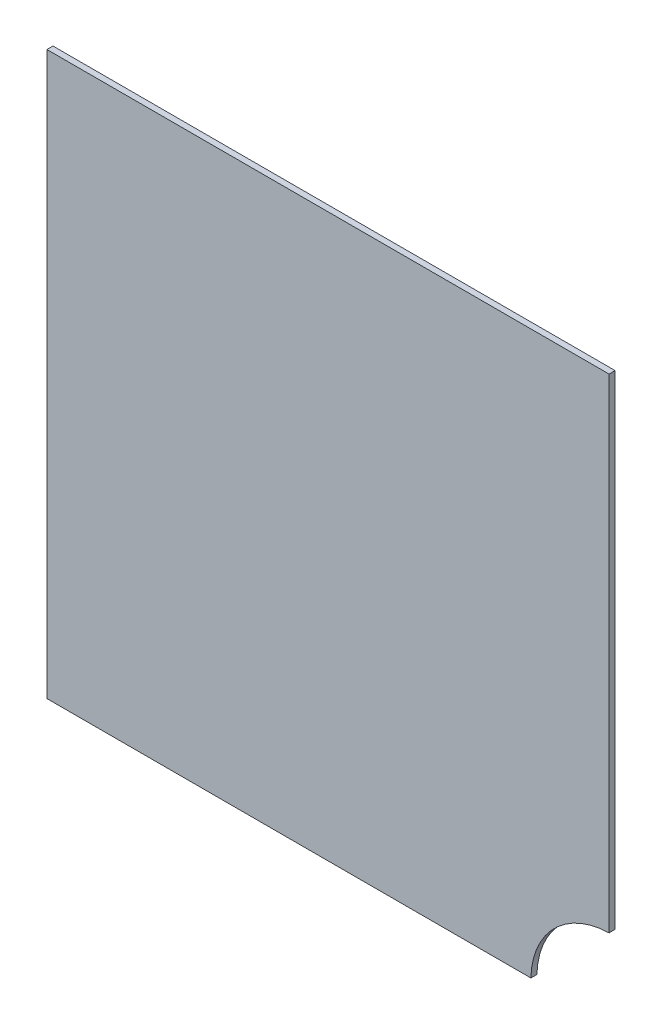
ISO-10303-21;
HEADER;
FILE_DESCRIPTION(('STEP AP214'),'2;1');
FILE_NAME('part.step','',(''),(''),'','','');
FILE_SCHEMA(('AUTOMOTIVE_DESIGN { 1 0 10303 214 1 1 1 1 }'));
ENDSEC;
DATA;
#1=APPLICATION_CONTEXT('core data for automotive mechanical design processes');
#2=APPLICATION_PROTOCOL_DEFINITION('international standard','automotive_design',2000,#1);
#3=PRODUCT_CONTEXT('',#1,'mechanical');
#4=PRODUCT('Part','Part','',(#3));
#5=PRODUCT_RELATED_PRODUCT_CATEGORY('part','',(#4));
#6=PRODUCT_DEFINITION_FORMATION('','',#4);
#7=PRODUCT_DEFINITION_CONTEXT('part definition',#1,'design');
#8=PRODUCT_DEFINITION('design','',#6,#7);
#9=PRODUCT_DEFINITION_SHAPE('','',#8);
#10=(LENGTH_UNIT() NAMED_UNIT(*) SI_UNIT(.MILLI.,.METRE.));
#11=(NAMED_UNIT(*) PLANE_ANGLE_UNIT() SI_UNIT($,.RADIAN.));
#12=(NAMED_UNIT(*) SI_UNIT($,.STERADIAN.) SOLID_ANGLE_UNIT());
#13=UNCERTAINTY_MEASURE_WITH_UNIT(LENGTH_MEASURE(1.E-05),#10,'distance_accuracy_value','');
#14=(GEOMETRIC_REPRESENTATION_CONTEXT(3) GLOBAL_UNCERTAINTY_ASSIGNED_CONTEXT((#13)) GLOBAL_UNIT_ASSIGNED_CONTEXT((#10,
#11,#12)) REPRESENTATION_CONTEXT('',''));
#15=CARTESIAN_POINT('',(0.,0.,0.));
#16=DIRECTION('',(0.,0.,1.));
#17=DIRECTION('',(1.,0.,0.));
#18=AXIS2_PLACEMENT_3D('',#15,#16,#17);
#19=CARTESIAN_POINT('',(318.999999999414,-62.9999999995483,3.));
#20=DIRECTION('',(0.,-1.,0.));
#21=DIRECTION('',(1.,0.,0.));
#22=AXIS2_PLACEMENT_3D('',#19,#20,#21);
#23=PLANE('',#22);
#24=DIRECTION('',(-1.,0.,0.));
#25=VECTOR('',#24,1.);
#26=CARTESIAN_POINT('',(318.999999999414,-62.9999999995483,0.));
#27=LINE('',#26,#25);
#28=CARTESIAN_POINT('',(317.999999999414,-62.9999999995483,0.));
#29=VERTEX_POINT('',#28);
#30=CARTESIAN_POINT('',(38.9999999994141,-62.9999999995484,0.));
#31=VERTEX_POINT('',#30);
#32=EDGE_CURVE('E80',#29,#31,#27,.T.);
#33=ORIENTED_EDGE('',*,*,#32,.T.);
#34=DIRECTION('',(0.,0.,-1.));
#35=VECTOR('',#34,1.);
#36=CARTESIAN_POINT('',(38.9999999994141,-62.9999999995484,3.));
#37=LINE('',#36,#35);
#38=CARTESIAN_POINT('',(38.9999999994141,-62.9999999995484,3.));
#39=VERTEX_POINT('',#38);
#40=EDGE_CURVE('E11',#39,#31,#37,.T.);
#41=ORIENTED_EDGE('',*,*,#40,.F.);
#42=DIRECTION('',(-1.,0.,0.));
#43=VECTOR('',#42,1.);
#44=CARTESIAN_POINT('',(318.999999999414,-62.9999999995483,3.));
#45=LINE('',#44,#43);
#46=CARTESIAN_POINT('',(317.999999999414,-62.9999999995483,3.));
#47=VERTEX_POINT('',#46);
#48=EDGE_CURVE('E74',#47,#39,#45,.T.);
#49=ORIENTED_EDGE('',*,*,#48,.F.);
#50=DIRECTION('',(0.,0.,-1.));
#51=VECTOR('',#50,1.);
#52=CARTESIAN_POINT('',(317.999999999414,-62.9999999995483,3.));
#53=LINE('',#52,#51);
#54=EDGE_CURVE('E21',#47,#29,#53,.T.);
#55=ORIENTED_EDGE('',*,*,#54,.T.);
#56=EDGE_LOOP('',(#33,#41,#49,#55));
#57=FACE_BOUND('',#56,.T.);
#58=ADVANCED_FACE('F17',(#57),#23,.F.);
#59=CARTESIAN_POINT('',(38.9999999994141,-62.9999999995484,3.));
#60=DIRECTION('',(1.,0.,0.));
#61=DIRECTION('',(0.,1.,0.));
#62=AXIS2_PLACEMENT_3D('',#59,#60,#61);
#63=PLANE('',#62);
#64=DIRECTION('',(0.,-1.,0.));
#65=VECTOR('',#64,1.);
#66=CARTESIAN_POINT('',(38.9999999994141,-62.9999999995484,0.));
#67=LINE('',#66,#65);
#68=CARTESIAN_POINT('',(38.9999999994142,-341.999999999548,0.));
#69=VERTEX_POINT('',#68);
#70=EDGE_CURVE('E83',#31,#69,#67,.T.);
#71=ORIENTED_EDGE('',*,*,#70,.T.);
#72=DIRECTION('',(0.,0.,-1.));
#73=VECTOR('',#72,1.);
#74=CARTESIAN_POINT('',(38.9999999994142,-341.999999999548,3.));
#75=LINE('',#74,#73);
#76=CARTESIAN_POINT('',(38.9999999994142,-341.999999999548,3.));
#77=VERTEX_POINT('',#76);
#78=EDGE_CURVE('E27',#77,#69,#75,.T.);
#79=ORIENTED_EDGE('',*,*,#78,.F.);
#80=DIRECTION('',(0.,-1.,0.));
#81=VECTOR('',#80,1.);
#82=CARTESIAN_POINT('',(38.9999999994141,-62.9999999995484,3.));
#83=LINE('',#82,#81);
#84=EDGE_CURVE('E61',#39,#77,#83,.T.);
#85=ORIENTED_EDGE('',*,*,#84,.F.);
#86=ORIENTED_EDGE('',*,*,#40,.T.);
#87=EDGE_LOOP('',(#71,#79,#85,#86));
#88=FACE_BOUND('',#87,.T.);
#89=ADVANCED_FACE('F108',(#88),#63,.F.);
#90=CARTESIAN_POINT('',(38.9999999994142,-341.999999999548,3.));
#91=DIRECTION('',(0.,1.,0.));
#92=DIRECTION('',(0.,0.,1.));
#93=AXIS2_PLACEMENT_3D('',#90,#91,#92);
#94=PLANE('',#93);
#95=DIRECTION('',(1.,0.,0.));
#96=VECTOR('',#95,1.);
#97=CARTESIAN_POINT('',(38.9999999994142,-341.999999999548,0.));
#98=LINE('',#97,#96);
#99=CARTESIAN_POINT('',(279.206392866898,-341.999999999548,0.));
#100=VERTEX_POINT('',#99);
#101=EDGE_CURVE('E85',#69,#100,#98,.T.);
#102=ORIENTED_EDGE('',*,*,#101,.T.);
#103=DIRECTION('',(0.,0.,-1.));
#104=VECTOR('',#103,1.);
#105=CARTESIAN_POINT('',(279.206392866898,-341.999999999548,3.));
#106=LINE('',#105,#104);
#107=CARTESIAN_POINT('',(279.206392866898,-341.999999999548,3.));
#108=VERTEX_POINT('',#107);
#109=EDGE_CURVE('E95',#108,#100,#106,.T.);
#110=ORIENTED_EDGE('',*,*,#109,.F.);
#111=DIRECTION('',(1.,0.,0.));
#112=VECTOR('',#111,1.);
#113=CARTESIAN_POINT('',(38.9999999994142,-341.999999999548,3.));
#114=LINE('',#113,#112);
#115=EDGE_CURVE('E96',#77,#108,#114,.T.);
#116=ORIENTED_EDGE('',*,*,#115,.F.);
#117=ORIENTED_EDGE('',*,*,#78,.T.);
#118=EDGE_LOOP('',(#102,#110,#116,#117));
#119=FACE_BOUND('',#118,.T.);
#120=ADVANCED_FACE('F107',(#119),#94,.F.);
#121=CARTESIAN_POINT('',(318.999999999414,-342.999999999548,3.));
#122=DIRECTION('',(0.,0.,-1.));
#123=DIRECTION('',(-1.,0.,0.));
#124=AXIS2_PLACEMENT_3D('',#121,#122,#123);
#125=CYLINDRICAL_SURFACE('',#124,39.8061699817641);
#126=CARTESIAN_POINT('',(318.999999999414,-342.999999999548,0.));
#127=DIRECTION('',(0.,0.,-1.));
#128=DIRECTION('',(1.,0.,0.));
#129=AXIS2_PLACEMENT_3D('',#126,#127,#128);
#130=CIRCLE('',#129,39.8061699817641);
#131=CARTESIAN_POINT('',(317.999999999414,-303.206392867031,0.));
#132=VERTEX_POINT('',#131);
#133=EDGE_CURVE('E75',#100,#132,#130,.T.);
#134=ORIENTED_EDGE('',*,*,#133,.T.);
#135=DIRECTION('',(0.,0.,-1.));
#136=VECTOR('',#135,1.);
#137=CARTESIAN_POINT('',(317.999999999414,-303.206392867031,3.));
#138=LINE('',#137,#136);
#139=CARTESIAN_POINT('',(317.999999999414,-303.206392867031,3.));
#140=VERTEX_POINT('',#139);
#141=EDGE_CURVE('E70',#140,#132,#138,.T.);
#142=ORIENTED_EDGE('',*,*,#141,.F.);
#143=CARTESIAN_POINT('',(318.999999999414,-342.999999999548,3.));
#144=DIRECTION('',(0.,0.,-1.));
#145=DIRECTION('',(1.,0.,0.));
#146=AXIS2_PLACEMENT_3D('',#143,#144,#145);
#147=CIRCLE('',#146,39.8061699817641);
#148=EDGE_CURVE('E88',#108,#140,#147,.T.);
#149=ORIENTED_EDGE('',*,*,#148,.F.);
#150=ORIENTED_EDGE('',*,*,#109,.T.);
#151=EDGE_LOOP('',(#134,#142,#149,#150));
#152=FACE_BOUND('',#151,.T.);
#153=ADVANCED_FACE('F105',(#152),#125,.F.);
#154=CARTESIAN_POINT('',(317.999999999414,-62.9999999995483,3.));
#155=DIRECTION('',(-1.,0.,0.));
#156=DIRECTION('',(0.,-1.,0.));
#157=AXIS2_PLACEMENT_3D('',#154,#155,#156);
#158=PLANE('',#157);
#159=DIRECTION('',(0.,1.,0.));
#160=VECTOR('',#159,1.);
#161=CARTESIAN_POINT('',(317.999999999414,-62.9999999995483,0.));
#162=LINE('',#161,#160);
#163=EDGE_CURVE('E66',#132,#29,#162,.T.);
#164=ORIENTED_EDGE('',*,*,#163,.T.);
#165=ORIENTED_EDGE('',*,*,#54,.F.);
#166=DIRECTION('',(0.,1.,0.));
#167=VECTOR('',#166,1.);
#168=CARTESIAN_POINT('',(317.999999999414,-62.9999999995483,3.));
#169=LINE('',#168,#167);
#170=EDGE_CURVE('E35',#140,#47,#169,.T.);
#171=ORIENTED_EDGE('',*,*,#170,.F.);
#172=ORIENTED_EDGE('',*,*,#141,.T.);
#173=EDGE_LOOP('',(#164,#165,#171,#172));
#174=FACE_BOUND('',#173,.T.);
#175=ADVANCED_FACE('F19',(#174),#158,.F.);
#176=CARTESIAN_POINT('',(318.999999999414,-342.999999999548,3.));
#177=DIRECTION('',(0.,0.,1.));
#178=DIRECTION('',(1.,0.,0.));
#179=AXIS2_PLACEMENT_3D('',#176,#177,#178);
#180=PLANE('',#179);
#181=ORIENTED_EDGE('',*,*,#48,.T.);
#182=ORIENTED_EDGE('',*,*,#84,.T.);
#183=ORIENTED_EDGE('',*,*,#115,.T.);
#184=ORIENTED_EDGE('',*,*,#148,.T.);
#185=ORIENTED_EDGE('',*,*,#170,.T.);
#186=EDGE_LOOP('',(#181,#182,#183,#184,#185));
#187=FACE_BOUND('',#186,.T.);
#188=ADVANCED_FACE('F101',(#187),#180,.T.);
#189=CARTESIAN_POINT('',(318.999999999414,-342.999999999548,0.));
#190=DIRECTION('',(0.,0.,1.));
#191=DIRECTION('',(1.,0.,0.));
#192=AXIS2_PLACEMENT_3D('',#189,#190,#191);
#193=PLANE('',#192);
#194=ORIENTED_EDGE('',*,*,#32,.F.);
#195=ORIENTED_EDGE('',*,*,#163,.F.);
#196=ORIENTED_EDGE('',*,*,#133,.F.);
#197=ORIENTED_EDGE('',*,*,#101,.F.);
#198=ORIENTED_EDGE('',*,*,#70,.F.);
#199=EDGE_LOOP('',(#194,#195,#196,#197,#198));
#200=FACE_BOUND('',#199,.T.);
#201=ADVANCED_FACE('F81',(#200),#193,.F.);
#202=CLOSED_SHELL('',(#58,#89,#120,#153,#175,#188,#201));
#203=MANIFOLD_SOLID_BREP('B1',#202);
#204=ADVANCED_BREP_SHAPE_REPRESENTATION('',(#18,#203),#14);
#205=SHAPE_DEFINITION_REPRESENTATION(#9,#204);
ENDSEC;
END-ISO-10303-21;
